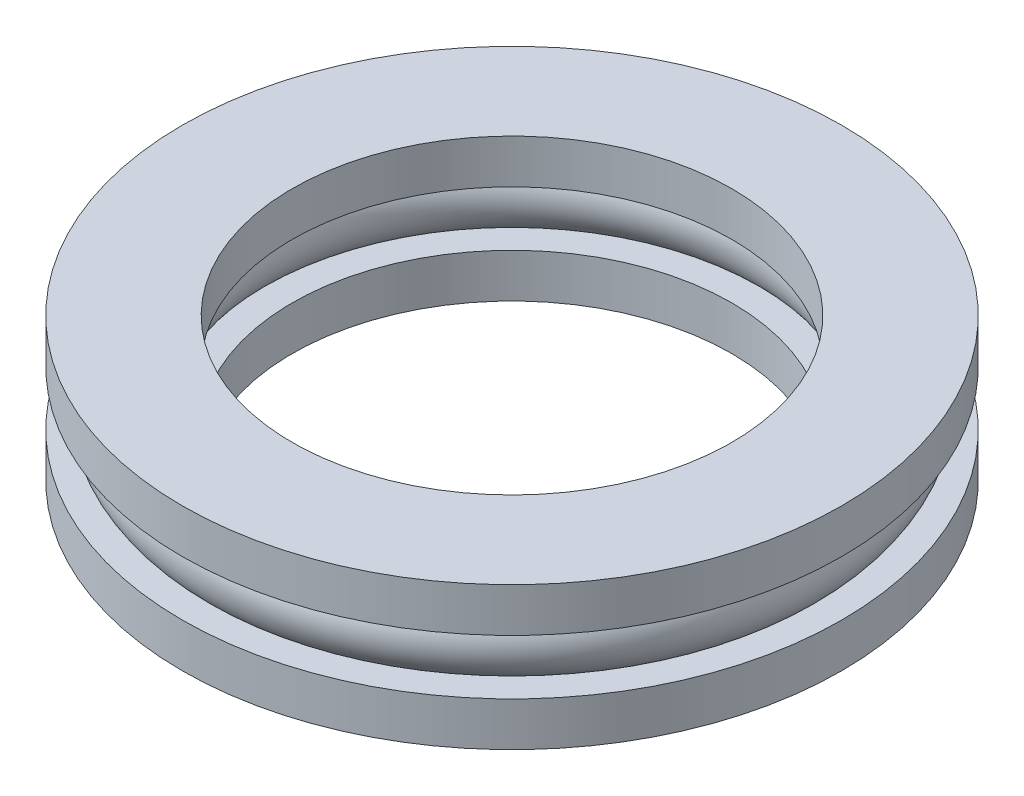
ISO-10303-21;
HEADER;
FILE_DESCRIPTION(('STEP AP214'),'2;1');
FILE_NAME('part.step','',(''),(''),'','','');
FILE_SCHEMA(('AUTOMOTIVE_DESIGN { 1 0 10303 214 1 1 1 1 }'));
ENDSEC;
DATA;
#1=APPLICATION_CONTEXT('core data for automotive mechanical design processes');
#2=APPLICATION_PROTOCOL_DEFINITION('international standard','automotive_design',2000,#1);
#3=PRODUCT_CONTEXT('',#1,'mechanical');
#4=PRODUCT('Part','Part','',(#3));
#5=PRODUCT_RELATED_PRODUCT_CATEGORY('part','',(#4));
#6=PRODUCT_DEFINITION_FORMATION('','',#4);
#7=PRODUCT_DEFINITION_CONTEXT('part definition',#1,'design');
#8=PRODUCT_DEFINITION('design','',#6,#7);
#9=PRODUCT_DEFINITION_SHAPE('','',#8);
#10=(LENGTH_UNIT() NAMED_UNIT(*) SI_UNIT(.MILLI.,.METRE.));
#11=(NAMED_UNIT(*) PLANE_ANGLE_UNIT() SI_UNIT($,.RADIAN.));
#12=(NAMED_UNIT(*) SI_UNIT($,.STERADIAN.) SOLID_ANGLE_UNIT());
#13=UNCERTAINTY_MEASURE_WITH_UNIT(LENGTH_MEASURE(1.E-05),#10,'distance_accuracy_value','');
#14=(GEOMETRIC_REPRESENTATION_CONTEXT(3) GLOBAL_UNCERTAINTY_ASSIGNED_CONTEXT((#13)) GLOBAL_UNIT_ASSIGNED_CONTEXT((#10,
#11,#12)) REPRESENTATION_CONTEXT('',''));
#15=CARTESIAN_POINT('',(0.,0.,0.));
#16=DIRECTION('',(0.,0.,1.));
#17=DIRECTION('',(1.,0.,0.));
#18=AXIS2_PLACEMENT_3D('',#15,#16,#17);
#19=CARTESIAN_POINT('',(0.,0.,0.));
#20=DIRECTION('',(0.,-1.,0.));
#21=DIRECTION('',(0.,0.,-1.));
#22=AXIS2_PLACEMENT_3D('',#19,#20,#21);
#23=TOROIDAL_SURFACE('',#22,25.,3.5);
#24=CARTESIAN_POINT('',(0.,2.5,0.));
#25=DIRECTION('',(0.,-1.,0.));
#26=DIRECTION('',(0.,0.,-1.));
#27=AXIS2_PLACEMENT_3D('',#24,#25,#26);
#28=CIRCLE('',#27,27.4494897427832);
#29=CARTESIAN_POINT('',(0.,2.5,-27.4494897427832));
#30=VERTEX_POINT('',#29);
#31=EDGE_CURVE('E75',#30,#30,#28,.T.);
#32=ORIENTED_EDGE('',*,*,#31,.T.);
#33=EDGE_LOOP('',(#32));
#34=FACE_BOUND('',#33,.T.);
#35=CARTESIAN_POINT('',(0.,-2.5,0.));
#36=DIRECTION('',(0.,-1.,0.));
#37=DIRECTION('',(0.,0.,-1.));
#38=AXIS2_PLACEMENT_3D('',#35,#36,#37);
#39=CIRCLE('',#38,27.4494897427832);
#40=CARTESIAN_POINT('',(0.,-2.5,-27.4494897427832));
#41=VERTEX_POINT('',#40);
#42=EDGE_CURVE('E71',#41,#41,#39,.T.);
#43=ORIENTED_EDGE('',*,*,#42,.F.);
#44=EDGE_LOOP('',(#43));
#45=FACE_BOUND('',#44,.T.);
#46=ADVANCED_FACE('F39',(#34,#45),#23,.T.);
#47=CARTESIAN_POINT('',(0.,-2.5,0.));
#48=DIRECTION('',(0.,-1.,0.));
#49=DIRECTION('',(0.,0.,-1.));
#50=AXIS2_PLACEMENT_3D('',#47,#48,#49);
#51=CIRCLE('',#50,22.5505102572168);
#52=CARTESIAN_POINT('',(0.,-2.5,-22.5505102572168));
#53=VERTEX_POINT('',#52);
#54=EDGE_CURVE('E47',#53,#53,#51,.T.);
#55=ORIENTED_EDGE('',*,*,#54,.T.);
#56=EDGE_LOOP('',(#55));
#57=FACE_BOUND('',#56,.T.);
#58=CARTESIAN_POINT('',(0.,2.5,0.));
#59=DIRECTION('',(0.,-1.,0.));
#60=DIRECTION('',(0.,0.,-1.));
#61=AXIS2_PLACEMENT_3D('',#58,#59,#60);
#62=CIRCLE('',#61,22.5505102572168);
#63=CARTESIAN_POINT('',(0.,2.5,-22.5505102572168));
#64=VERTEX_POINT('',#63);
#65=EDGE_CURVE('E10',#64,#64,#62,.T.);
#66=ORIENTED_EDGE('',*,*,#65,.F.);
#67=EDGE_LOOP('',(#66));
#68=FACE_BOUND('',#67,.T.);
#69=ADVANCED_FACE('F117',(#57,#68),#23,.T.);
#70=CARTESIAN_POINT('',(0.,6.5,0.));
#71=DIRECTION('',(0.,-1.,0.));
#72=DIRECTION('',(0.,0.,-1.));
#73=AXIS2_PLACEMENT_3D('',#70,#71,#72);
#74=PLANE('',#73);
#75=CARTESIAN_POINT('',(0.,6.5,0.));
#76=DIRECTION('',(0.,-1.,0.));
#77=DIRECTION('',(0.,0.,-1.));
#78=AXIS2_PLACEMENT_3D('',#75,#76,#77);
#79=CIRCLE('',#78,30.);
#80=CARTESIAN_POINT('',(0.,6.5,-30.));
#81=VERTEX_POINT('',#80);
#82=EDGE_CURVE('E83',#81,#81,#79,.T.);
#83=ORIENTED_EDGE('',*,*,#82,.F.);
#84=EDGE_LOOP('',(#83));
#85=FACE_BOUND('',#84,.T.);
#86=CARTESIAN_POINT('',(0.,6.5,0.));
#87=DIRECTION('',(0.,-1.,0.));
#88=DIRECTION('',(0.,0.,-1.));
#89=AXIS2_PLACEMENT_3D('',#86,#87,#88);
#90=CIRCLE('',#89,20.);
#91=CARTESIAN_POINT('',(0.,6.5,-20.));
#92=VERTEX_POINT('',#91);
#93=EDGE_CURVE('E87',#92,#92,#90,.T.);
#94=ORIENTED_EDGE('',*,*,#93,.T.);
#95=EDGE_LOOP('',(#94));
#96=FACE_BOUND('',#95,.T.);
#97=ADVANCED_FACE('F119',(#85,#96),#74,.F.);
#98=CARTESIAN_POINT('',(0.,0.,0.));
#99=DIRECTION('',(0.,-1.,0.));
#100=DIRECTION('',(0.,0.,-1.));
#101=AXIS2_PLACEMENT_3D('',#98,#99,#100);
#102=CYLINDRICAL_SURFACE('',#101,30.);
#103=CARTESIAN_POINT('',(0.,2.5,0.));
#104=DIRECTION('',(0.,-1.,0.));
#105=DIRECTION('',(0.,0.,-1.));
#106=AXIS2_PLACEMENT_3D('',#103,#104,#105);
#107=CIRCLE('',#106,30.);
#108=CARTESIAN_POINT('',(0.,2.5,-30.));
#109=VERTEX_POINT('',#108);
#110=EDGE_CURVE('E79',#109,#109,#107,.T.);
#111=ORIENTED_EDGE('',*,*,#110,.F.);
#112=EDGE_LOOP('',(#111));
#113=FACE_BOUND('',#112,.T.);
#114=ORIENTED_EDGE('',*,*,#82,.T.);
#115=EDGE_LOOP('',(#114));
#116=FACE_BOUND('',#115,.T.);
#117=ADVANCED_FACE('F114',(#113,#116),#102,.T.);
#118=CARTESIAN_POINT('',(0.,2.5,0.));
#119=DIRECTION('',(0.,-1.,0.));
#120=DIRECTION('',(0.,0.,-1.));
#121=AXIS2_PLACEMENT_3D('',#118,#119,#120);
#122=PLANE('',#121);
#123=ORIENTED_EDGE('',*,*,#110,.T.);
#124=EDGE_LOOP('',(#123));
#125=FACE_BOUND('',#124,.T.);
#126=ORIENTED_EDGE('',*,*,#31,.F.);
#127=EDGE_LOOP('',(#126));
#128=FACE_BOUND('',#127,.T.);
#129=ADVANCED_FACE('F103',(#125,#128),#122,.T.);
#130=CARTESIAN_POINT('',(0.,0.,0.));
#131=DIRECTION('',(0.,-1.,0.));
#132=DIRECTION('',(0.,0.,-1.));
#133=AXIS2_PLACEMENT_3D('',#130,#131,#132);
#134=CYLINDRICAL_SURFACE('',#133,20.);
#135=CARTESIAN_POINT('',(0.,2.5,0.));
#136=DIRECTION('',(0.,-1.,0.));
#137=DIRECTION('',(0.,0.,-1.));
#138=AXIS2_PLACEMENT_3D('',#135,#136,#137);
#139=CIRCLE('',#138,20.);
#140=CARTESIAN_POINT('',(0.,2.5,-20.));
#141=VERTEX_POINT('',#140);
#142=EDGE_CURVE('E91',#141,#141,#139,.T.);
#143=ORIENTED_EDGE('',*,*,#142,.T.);
#144=EDGE_LOOP('',(#143));
#145=FACE_BOUND('',#144,.T.);
#146=ORIENTED_EDGE('',*,*,#93,.F.);
#147=EDGE_LOOP('',(#146));
#148=FACE_BOUND('',#147,.T.);
#149=ADVANCED_FACE('F96',(#145,#148),#134,.F.);
#150=ORIENTED_EDGE('',*,*,#65,.T.);
#151=EDGE_LOOP('',(#150));
#152=FACE_BOUND('',#151,.T.);
#153=ORIENTED_EDGE('',*,*,#142,.F.);
#154=EDGE_LOOP('',(#153));
#155=FACE_BOUND('',#154,.T.);
#156=ADVANCED_FACE('F99',(#152,#155),#122,.T.);
#157=CARTESIAN_POINT('',(0.,-6.5,0.));
#158=DIRECTION('',(0.,-1.,0.));
#159=DIRECTION('',(0.,0.,-1.));
#160=AXIS2_PLACEMENT_3D('',#157,#158,#159);
#161=PLANE('',#160);
#162=CARTESIAN_POINT('',(0.,-6.5,0.));
#163=DIRECTION('',(0.,-1.,0.));
#164=DIRECTION('',(0.,0.,-1.));
#165=AXIS2_PLACEMENT_3D('',#162,#163,#164);
#166=CIRCLE('',#165,30.);
#167=CARTESIAN_POINT('',(0.,-6.5,-30.));
#168=VERTEX_POINT('',#167);
#169=EDGE_CURVE('E63',#168,#168,#166,.T.);
#170=ORIENTED_EDGE('',*,*,#169,.T.);
#171=EDGE_LOOP('',(#170));
#172=FACE_BOUND('',#171,.T.);
#173=CARTESIAN_POINT('',(0.,-6.5,0.));
#174=DIRECTION('',(0.,-1.,0.));
#175=DIRECTION('',(0.,0.,-1.));
#176=AXIS2_PLACEMENT_3D('',#173,#174,#175);
#177=CIRCLE('',#176,20.);
#178=CARTESIAN_POINT('',(0.,-6.5,-20.));
#179=VERTEX_POINT('',#178);
#180=EDGE_CURVE('E57',#179,#179,#177,.T.);
#181=ORIENTED_EDGE('',*,*,#180,.F.);
#182=EDGE_LOOP('',(#181));
#183=FACE_BOUND('',#182,.T.);
#184=ADVANCED_FACE('F101',(#172,#183),#161,.T.);
#185=CARTESIAN_POINT('',(0.,0.,0.));
#186=DIRECTION('',(0.,-1.,0.));
#187=DIRECTION('',(0.,0.,-1.));
#188=AXIS2_PLACEMENT_3D('',#185,#186,#187);
#189=CYLINDRICAL_SURFACE('',#188,30.);
#190=ORIENTED_EDGE('',*,*,#169,.F.);
#191=EDGE_LOOP('',(#190));
#192=FACE_BOUND('',#191,.T.);
#193=CARTESIAN_POINT('',(0.,-2.5,0.));
#194=DIRECTION('',(0.,-1.,0.));
#195=DIRECTION('',(0.,0.,-1.));
#196=AXIS2_PLACEMENT_3D('',#193,#194,#195);
#197=CIRCLE('',#196,30.);
#198=CARTESIAN_POINT('',(0.,-2.5,-30.));
#199=VERTEX_POINT('',#198);
#200=EDGE_CURVE('E67',#199,#199,#197,.T.);
#201=ORIENTED_EDGE('',*,*,#200,.T.);
#202=EDGE_LOOP('',(#201));
#203=FACE_BOUND('',#202,.T.);
#204=ADVANCED_FACE('F108',(#192,#203),#189,.T.);
#205=CARTESIAN_POINT('',(0.,-2.5,0.));
#206=DIRECTION('',(0.,-1.,0.));
#207=DIRECTION('',(0.,0.,-1.));
#208=AXIS2_PLACEMENT_3D('',#205,#206,#207);
#209=PLANE('',#208);
#210=ORIENTED_EDGE('',*,*,#200,.F.);
#211=EDGE_LOOP('',(#210));
#212=FACE_BOUND('',#211,.T.);
#213=ORIENTED_EDGE('',*,*,#42,.T.);
#214=EDGE_LOOP('',(#213));
#215=FACE_BOUND('',#214,.T.);
#216=ADVANCED_FACE('F169',(#212,#215),#209,.F.);
#217=CARTESIAN_POINT('',(0.,0.,0.));
#218=DIRECTION('',(0.,-1.,0.));
#219=DIRECTION('',(0.,0.,-1.));
#220=AXIS2_PLACEMENT_3D('',#217,#218,#219);
#221=CYLINDRICAL_SURFACE('',#220,20.);
#222=ORIENTED_EDGE('',*,*,#180,.T.);
#223=EDGE_LOOP('',(#222));
#224=FACE_BOUND('',#223,.T.);
#225=CARTESIAN_POINT('',(0.,-2.5,0.));
#226=DIRECTION('',(0.,-1.,0.));
#227=DIRECTION('',(0.,0.,-1.));
#228=AXIS2_PLACEMENT_3D('',#225,#226,#227);
#229=CIRCLE('',#228,20.);
#230=CARTESIAN_POINT('',(0.,-2.5,-20.));
#231=VERTEX_POINT('',#230);
#232=EDGE_CURVE('E52',#231,#231,#229,.T.);
#233=ORIENTED_EDGE('',*,*,#232,.F.);
#234=EDGE_LOOP('',(#233));
#235=FACE_BOUND('',#234,.T.);
#236=ADVANCED_FACE('F41',(#224,#235),#221,.F.);
#237=ORIENTED_EDGE('',*,*,#54,.F.);
#238=EDGE_LOOP('',(#237));
#239=FACE_BOUND('',#238,.T.);
#240=ORIENTED_EDGE('',*,*,#232,.T.);
#241=EDGE_LOOP('',(#240));
#242=FACE_BOUND('',#241,.T.);
#243=ADVANCED_FACE('F123',(#239,#242),#209,.F.);
#244=CLOSED_SHELL('',(#46,#69,#97,#117,#129,#149,#156,#184,#204,#216,#236,#243));
#245=MANIFOLD_SOLID_BREP('B2',#244);
#246=ADVANCED_BREP_SHAPE_REPRESENTATION('',(#18,#245),#14);
#247=SHAPE_DEFINITION_REPRESENTATION(#9,#246);
ENDSEC;
END-ISO-10303-21;
